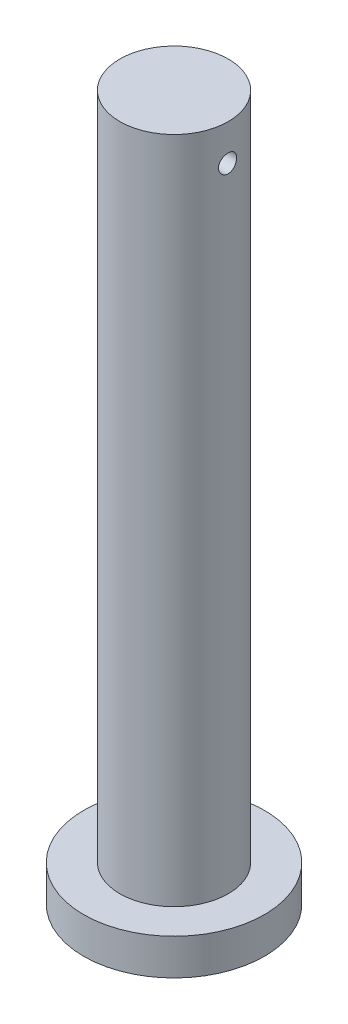
ISO-10303-21;
HEADER;
FILE_DESCRIPTION(('STEP AP214'),'2;1');
FILE_NAME('part.step','',(''),(''),'','','');
FILE_SCHEMA(('AUTOMOTIVE_DESIGN { 1 0 10303 214 1 1 1 1 }'));
ENDSEC;
DATA;
#1=APPLICATION_CONTEXT('core data for automotive mechanical design processes');
#2=APPLICATION_PROTOCOL_DEFINITION('international standard','automotive_design',2000,#1);
#3=PRODUCT_CONTEXT('',#1,'mechanical');
#4=PRODUCT('Part','Part','',(#3));
#5=PRODUCT_RELATED_PRODUCT_CATEGORY('part','',(#4));
#6=PRODUCT_DEFINITION_FORMATION('','',#4);
#7=PRODUCT_DEFINITION_CONTEXT('part definition',#1,'design');
#8=PRODUCT_DEFINITION('design','',#6,#7);
#9=PRODUCT_DEFINITION_SHAPE('','',#8);
#10=(LENGTH_UNIT() NAMED_UNIT(*) SI_UNIT(.MILLI.,.METRE.));
#11=(NAMED_UNIT(*) PLANE_ANGLE_UNIT() SI_UNIT($,.RADIAN.));
#12=(NAMED_UNIT(*) SI_UNIT($,.STERADIAN.) SOLID_ANGLE_UNIT());
#13=UNCERTAINTY_MEASURE_WITH_UNIT(LENGTH_MEASURE(1.E-05),#10,'distance_accuracy_value','');
#14=(GEOMETRIC_REPRESENTATION_CONTEXT(3) GLOBAL_UNCERTAINTY_ASSIGNED_CONTEXT((#13)) GLOBAL_UNIT_ASSIGNED_CONTEXT((#10,
#11,#12)) REPRESENTATION_CONTEXT('',''));
#15=CARTESIAN_POINT('',(0.,0.,0.));
#16=DIRECTION('',(0.,0.,1.));
#17=DIRECTION('',(1.,0.,0.));
#18=AXIS2_PLACEMENT_3D('',#15,#16,#17);
#19=CARTESIAN_POINT('',(0.,10.,0.));
#20=DIRECTION('',(0.,-1.,0.));
#21=DIRECTION('',(0.,0.,-1.));
#22=AXIS2_PLACEMENT_3D('',#19,#20,#21);
#23=CYLINDRICAL_SURFACE('',#22,25.);
#24=CARTESIAN_POINT('',(0.,10.,0.));
#25=DIRECTION('',(0.,1.,0.));
#26=DIRECTION('',(0.,0.,1.));
#27=AXIS2_PLACEMENT_3D('',#24,#25,#26);
#28=CIRCLE('',#27,25.);
#29=CARTESIAN_POINT('',(0.,10.,25.));
#30=VERTEX_POINT('',#29);
#31=EDGE_CURVE('E49',#30,#30,#28,.T.);
#32=ORIENTED_EDGE('',*,*,#31,.F.);
#33=EDGE_LOOP('',(#32));
#34=FACE_BOUND('',#33,.T.);
#35=CARTESIAN_POINT('',(0.,0.,0.));
#36=DIRECTION('',(0.,1.,0.));
#37=DIRECTION('',(0.,0.,1.));
#38=AXIS2_PLACEMENT_3D('',#35,#36,#37);
#39=CIRCLE('',#38,25.);
#40=CARTESIAN_POINT('',(0.,0.,25.));
#41=VERTEX_POINT('',#40);
#42=EDGE_CURVE('E54',#41,#41,#39,.T.);
#43=ORIENTED_EDGE('',*,*,#42,.T.);
#44=EDGE_LOOP('',(#43));
#45=FACE_BOUND('',#44,.T.);
#46=ADVANCED_FACE('F37',(#34,#45),#23,.T.);
#47=CARTESIAN_POINT('',(0.,10.,0.));
#48=DIRECTION('',(0.,1.,0.));
#49=DIRECTION('',(0.,0.,1.));
#50=AXIS2_PLACEMENT_3D('',#47,#48,#49);
#51=PLANE('',#50);
#52=CARTESIAN_POINT('',(0.,10.,0.));
#53=DIRECTION('',(0.,1.,0.));
#54=DIRECTION('',(0.,0.,1.));
#55=AXIS2_PLACEMENT_3D('',#52,#53,#54);
#56=CIRCLE('',#55,15.);
#57=CARTESIAN_POINT('',(0.,10.,15.));
#58=VERTEX_POINT('',#57);
#59=EDGE_CURVE('E10',#58,#58,#56,.T.);
#60=ORIENTED_EDGE('',*,*,#59,.F.);
#61=EDGE_LOOP('',(#60));
#62=FACE_BOUND('',#61,.T.);
#63=ORIENTED_EDGE('',*,*,#31,.T.);
#64=EDGE_LOOP('',(#63));
#65=FACE_BOUND('',#64,.T.);
#66=ADVANCED_FACE('F85',(#62,#65),#51,.T.);
#67=CARTESIAN_POINT('',(0.,0.,0.));
#68=DIRECTION('',(0.,1.,0.));
#69=DIRECTION('',(0.,0.,1.));
#70=AXIS2_PLACEMENT_3D('',#67,#68,#69);
#71=PLANE('',#70);
#72=ORIENTED_EDGE('',*,*,#42,.F.);
#73=EDGE_LOOP('',(#72));
#74=FACE_BOUND('',#73,.T.);
#75=ADVANCED_FACE('F81',(#74),#71,.F.);
#76=CARTESIAN_POINT('',(0.,195.,0.));
#77=DIRECTION('',(0.,-1.,0.));
#78=DIRECTION('',(0.,0.,-1.));
#79=AXIS2_PLACEMENT_3D('',#76,#77,#78);
#80=CYLINDRICAL_SURFACE('',#79,15.);
#81=CARTESIAN_POINT('',(-14.790199457749,185.,-2.5));
#82=CARTESIAN_POINT('',(-14.790201973666,185.139375748162,-2.49999439841983));
#83=CARTESIAN_POINT('',(-14.7921909238523,185.278827606071,-2.48830516902828));
#84=CARTESIAN_POINT('',(-14.7999245720004,185.553818543263,-2.44187742806638));
#85=CARTESIAN_POINT('',(-14.8056727334637,185.689353893758,-2.40711766030861));
#86=CARTESIAN_POINT('',(-14.8202560936731,185.952492283342,-2.3156295436705));
#87=CARTESIAN_POINT('',(-14.8290887118401,186.080101848662,-2.25891955493198));
#88=CARTESIAN_POINT('',(-14.8488427210228,186.323980954718,-2.12518649688946));
#89=CARTESIAN_POINT('',(-14.8597638769423,186.440251769577,-2.04816571350132));
#90=CARTESIAN_POINT('',(-14.8825847115588,186.659312849745,-1.87518752696653));
#91=CARTESIAN_POINT('',(-14.8944921732795,186.761975131386,-1.77906904893232));
#92=CARTESIAN_POINT('',(-14.9178748066858,186.949793306862,-1.57097200469526));
#93=CARTESIAN_POINT('',(-14.9293499527173,187.034948163115,-1.45899249914996));
#94=CARTESIAN_POINT('',(-14.9506573698271,187.185814567219,-1.22152286994836));
#95=CARTESIAN_POINT('',(-14.9604794243234,187.251407007732,-1.09595608145672));
#96=CARTESIAN_POINT('',(-14.9772873695709,187.360521070531,-0.83539562172388));
#97=CARTESIAN_POINT('',(-14.9842734447266,187.404044127885,-0.700402564078197));
#98=CARTESIAN_POINT('',(-14.994567347244,187.467392534984,-0.426143726344252));
#99=CARTESIAN_POINT('',(-14.9979085311091,187.487432916005,-0.286928886679282));
#100=CARTESIAN_POINT('',(-15.0006507934278,187.503915754153,-0.00707528552580894));
#101=CARTESIAN_POINT('',(-15.0000521396931,187.500359815247,0.133563378528888));
#102=CARTESIAN_POINT('',(-14.9950085843139,187.469918648472,0.410802185078867));
#103=CARTESIAN_POINT('',(-14.990601836924,187.443264836591,0.547428530700132));
#104=CARTESIAN_POINT('',(-14.9784797877164,187.367748925753,0.814241979611784));
#105=CARTESIAN_POINT('',(-14.9707643851321,187.318886150411,0.9444288866515));
#106=CARTESIAN_POINT('',(-14.9528269851196,187.200109359685,1.19535614778264));
#107=CARTESIAN_POINT('',(-14.9425936732688,187.130099987918,1.31605052301904));
#108=CARTESIAN_POINT('',(-14.920757380715,186.971087177365,1.54406552984663));
#109=CARTESIAN_POINT('',(-14.9091542891913,186.882082201289,1.65138507791587));
#110=CARTESIAN_POINT('',(-14.885702682326,186.686321193381,1.85097127344666));
#111=CARTESIAN_POINT('',(-14.8738528973104,186.579362905099,1.94303950225321));
#112=CARTESIAN_POINT('',(-14.8513795978481,186.351412909784,2.10795458844807));
#113=CARTESIAN_POINT('',(-14.8407560947132,186.230421073317,2.18080126853242));
#114=CARTESIAN_POINT('',(-14.8219375456182,185.977608358123,2.30524443448828));
#115=CARTESIAN_POINT('',(-14.813745233026,185.845775501908,2.35681702727924));
#116=CARTESIAN_POINT('',(-14.8007618868988,185.575150927692,2.43702987081561));
#117=CARTESIAN_POINT('',(-14.7959705538832,185.436359823568,2.46567214076795));
#118=CARTESIAN_POINT('',(-14.7903895942212,185.157533843838,2.49893188487927));
#119=CARTESIAN_POINT('',(-14.7895528575867,185.017533620298,2.50383220791244));
#120=CARTESIAN_POINT('',(-14.7918503478236,184.738713328309,2.49022270268246));
#121=CARTESIAN_POINT('',(-14.7949844213185,184.599893214486,2.47171377862467));
#122=CARTESIAN_POINT('',(-14.8048268745502,184.328272240809,2.4120523349281));
#123=CARTESIAN_POINT('',(-14.8115125191835,184.195438860122,2.37104379064639));
#124=CARTESIAN_POINT('',(-14.827685730055,183.938529833721,2.26769819019229));
#125=CARTESIAN_POINT('',(-14.8371734639058,183.814454712449,2.20535985810096));
#126=CARTESIAN_POINT('',(-14.8579912839739,183.577325405594,2.06045667322925));
#127=CARTESIAN_POINT('',(-14.8693375560035,183.464383427244,1.97771056415938));
#128=CARTESIAN_POINT('',(-14.8925466667987,183.253886467305,1.79458946570799));
#129=CARTESIAN_POINT('',(-14.9044095418533,183.15633256889,1.69421323638406));
#130=CARTESIAN_POINT('',(-14.9274642211826,182.978348107271,1.47742807032882));
#131=CARTESIAN_POINT('',(-14.9386477634467,182.898106173715,1.3608632533862));
#132=CARTESIAN_POINT('',(-14.9589511243294,182.758344672995,1.11574344794933));
#133=CARTESIAN_POINT('',(-14.9680710096998,182.698824435526,0.987188847470637));
#134=CARTESIAN_POINT('',(-14.9831835816958,182.602489416045,0.72229905150134));
#135=CARTESIAN_POINT('',(-14.9891898456762,182.565575924265,0.586000562602619));
#136=CARTESIAN_POINT('',(-14.9974558316928,182.515184401036,0.309030734874214));
#137=CARTESIAN_POINT('',(-14.9997158620019,182.501704441268,0.168359756821622));
#138=CARTESIAN_POINT('',(-15.0002303788781,182.498618117688,-0.111541275773678));
#139=CARTESIAN_POINT('',(-14.9985330202419,182.508724746059,-0.250768160602667));
#140=CARTESIAN_POINT('',(-14.9914217838733,182.551903922269,-0.525511974314706));
#141=CARTESIAN_POINT('',(-14.9860079269518,182.58497634151,-0.661028923967477));
#142=CARTESIAN_POINT('',(-14.972069888274,182.673038165544,-0.92439644591853));
#143=CARTESIAN_POINT('',(-14.9635491704088,182.72800316821,-1.05225537215381));
#144=CARTESIAN_POINT('',(-14.9443275687803,182.858257936231,-1.29698045298215));
#145=CARTESIAN_POINT('',(-14.9336265816741,182.933548665062,-1.41384608611821));
#146=CARTESIAN_POINT('',(-14.9110762961641,183.10333509246,-1.63471294552639));
#147=CARTESIAN_POINT('',(-14.8992152454112,183.198040954751,-1.73855143060275));
#148=CARTESIAN_POINT('',(-14.8757630331437,183.403528307904,-1.92896387595091));
#149=CARTESIAN_POINT('',(-14.8641719354951,183.514313558913,-2.01553378671189));
#150=CARTESIAN_POINT('',(-14.8424834353391,183.74974532249,-2.16951427091085));
#151=CARTESIAN_POINT('',(-14.8323971784578,183.874484339765,-2.23678498905769));
#152=CARTESIAN_POINT('',(-14.8149921009131,184.133609235838,-2.34931453640427));
#153=CARTESIAN_POINT('',(-14.8076705172488,184.267985322677,-2.39459535522307));
#154=CARTESIAN_POINT('',(-14.7982474485649,184.502403769487,-2.45202605312742));
#155=CARTESIAN_POINT('',(-14.7952462341947,184.601026807963,-2.46998741767139));
#156=CARTESIAN_POINT('',(-14.7912213528807,184.799753484837,-2.49397629518131));
#157=CARTESIAN_POINT('',(-14.7901976500369,184.899857096324,-2.50000402479277));
#158=CARTESIAN_POINT('',(-14.790199457749,185.,-2.5));
#159=B_SPLINE_CURVE_WITH_KNOTS('',3,(#81,#82,#83,#84,#85,#86,#87,#88,#89,#90,#91,#92,#93,#94,
#95,#96,#97,#98,#99,#100,#101,#102,#103,#104,#105,#106,#107,#108,#109,#110,#111,#112,#113,#114,
#115,#116,#117,#118,#119,#120,#121,#122,#123,#124,#125,#126,#127,#128,#129,#130,#131,#132,#133,
#134,#135,#136,#137,#138,#139,#140,#141,#142,#143,#144,#145,#146,#147,#148,#149,#150,#151,#152,
#153,#154,#155,#156,#157,#158),.UNSPECIFIED.,.T.,.F.,(4,2,2,2,2,2,2,2,2,2,2,2,2,2,2,2,2,2,2,2,2,
2,2,2,2,2,2,2,2,2,2,2,2,2,2,2,2,2,4),(0.,0.417761038927736,0.835907519962962,1.25370499787522,
1.67145547405275,2.09289159155718,2.51435267834448,2.93832980111434,3.36227935111112,
3.78231567472564,4.20232344652691,4.61817121164668,5.03403164249533,5.45179604139425,
5.86959426226764,6.29246123462125,6.71533210746018,7.13867662498602,7.56198385938074,
7.98023542420408,8.39847083413977,8.81406064635489,9.22967532293572,9.64912342762701,
10.0686010443069,10.4924411303538,10.916267504767,11.3382298441765,11.7601574591235,
12.1769777626592,12.5937957321882,13.0101503983246,13.4265248039234,13.8476699746325,
14.2689137888181,14.6931372761832,15.1169356674445,15.4171067054376,15.7172722940182),.UNSPECIFIED.);
#160=CARTESIAN_POINT('',(-14.790199457749,185.,-2.5));
#161=VERTEX_POINT('',#160);
#162=EDGE_CURVE('E40',#161,#161,#159,.T.);
#163=ORIENTED_EDGE('',*,*,#162,.T.);
#164=EDGE_LOOP('',(#163));
#165=FACE_BOUND('',#164,.T.);
#166=CARTESIAN_POINT('',(14.790199457749,185.,-2.5));
#167=CARTESIAN_POINT('',(14.790201973666,184.860624251838,-2.49999439841983));
#168=CARTESIAN_POINT('',(14.7921909238523,184.721172393929,-2.48830516902829));
#169=CARTESIAN_POINT('',(14.7999245720004,184.446181456737,-2.44187742806638));
#170=CARTESIAN_POINT('',(14.8056727334637,184.310646106242,-2.40711766030861));
#171=CARTESIAN_POINT('',(14.8202560936731,184.047507716658,-2.3156295436705));
#172=CARTESIAN_POINT('',(14.8290887118401,183.919898151338,-2.25891955493198));
#173=CARTESIAN_POINT('',(14.8488427210228,183.676019045282,-2.12518649688946));
#174=CARTESIAN_POINT('',(14.8597638769423,183.559748230423,-2.04816571350132));
#175=CARTESIAN_POINT('',(14.8825847115588,183.340687150255,-1.87518752696653));
#176=CARTESIAN_POINT('',(14.8944921732795,183.238024868614,-1.77906904893232));
#177=CARTESIAN_POINT('',(14.9178748066858,183.050206693138,-1.57097200469526));
#178=CARTESIAN_POINT('',(14.9293499527173,182.965051836885,-1.45899249914996));
#179=CARTESIAN_POINT('',(14.9506573698271,182.814185432781,-1.22152286994836));
#180=CARTESIAN_POINT('',(14.9604794243234,182.748592992268,-1.09595608145672));
#181=CARTESIAN_POINT('',(14.9772873695709,182.639478929469,-0.83539562172388));
#182=CARTESIAN_POINT('',(14.9842734447266,182.595955872115,-0.700402564078197));
#183=CARTESIAN_POINT('',(14.994567347244,182.532607465016,-0.426143726344252));
#184=CARTESIAN_POINT('',(14.9979085311091,182.512567083995,-0.286928886679282));
#185=CARTESIAN_POINT('',(15.0006507934278,182.496084245847,-0.00707528552580888));
#186=CARTESIAN_POINT('',(15.0000521396931,182.499640184753,0.133563378528888));
#187=CARTESIAN_POINT('',(14.9950085843139,182.530081351528,0.410802185078864));
#188=CARTESIAN_POINT('',(14.990601836924,182.556735163409,0.547428530700126));
#189=CARTESIAN_POINT('',(14.9784797877164,182.632251074246,0.81424197961178));
#190=CARTESIAN_POINT('',(14.9707643851321,182.681113849589,0.944428886651498));
#191=CARTESIAN_POINT('',(14.9528269851196,182.799890640315,1.19535614778264));
#192=CARTESIAN_POINT('',(14.9425936732688,182.869900012082,1.31605052301904));
#193=CARTESIAN_POINT('',(14.920757380715,183.028912822635,1.54406552984663));
#194=CARTESIAN_POINT('',(14.9091542891913,183.117917798711,1.65138507791587));
#195=CARTESIAN_POINT('',(14.885702682326,183.313678806619,1.85097127344666));
#196=CARTESIAN_POINT('',(14.8738528973104,183.420637094901,1.94303950225321));
#197=CARTESIAN_POINT('',(14.8513795978481,183.648587090216,2.10795458844807));
#198=CARTESIAN_POINT('',(14.8407560947132,183.769578926683,2.18080126853242));
#199=CARTESIAN_POINT('',(14.8219375456182,184.022391641877,2.30524443448828));
#200=CARTESIAN_POINT('',(14.813745233026,184.154224498092,2.35681702727924));
#201=CARTESIAN_POINT('',(14.8007618868988,184.424849072308,2.43702987081561));
#202=CARTESIAN_POINT('',(14.7959705538832,184.563640176432,2.46567214076795));
#203=CARTESIAN_POINT('',(14.7903895942212,184.842466156162,2.49893188487927));
#204=CARTESIAN_POINT('',(14.7895528575867,184.982466379702,2.50383220791244));
#205=CARTESIAN_POINT('',(14.7918503478236,185.261286671691,2.49022270268246));
#206=CARTESIAN_POINT('',(14.7949844213185,185.400106785514,2.47171377862467));
#207=CARTESIAN_POINT('',(14.8048268745502,185.671727759191,2.4120523349281));
#208=CARTESIAN_POINT('',(14.8115125191835,185.804561139878,2.37104379064639));
#209=CARTESIAN_POINT('',(14.827685730055,186.061470166279,2.26769819019229));
#210=CARTESIAN_POINT('',(14.8371734639058,186.185545287551,2.20535985810096));
#211=CARTESIAN_POINT('',(14.8579912839739,186.422674594406,2.06045667322925));
#212=CARTESIAN_POINT('',(14.8693375560035,186.535616572756,1.97771056415938));
#213=CARTESIAN_POINT('',(14.8925466667987,186.746113532695,1.79458946570799));
#214=CARTESIAN_POINT('',(14.9044095418533,186.84366743111,1.69421323638406));
#215=CARTESIAN_POINT('',(14.9274642211826,187.021651892729,1.47742807032882));
#216=CARTESIAN_POINT('',(14.9386477634467,187.101893826285,1.3608632533862));
#217=CARTESIAN_POINT('',(14.9589511243294,187.241655327005,1.11574344794933));
#218=CARTESIAN_POINT('',(14.9680710096998,187.301175564474,0.987188847470637));
#219=CARTESIAN_POINT('',(14.9831835816958,187.397510583955,0.72229905150134));
#220=CARTESIAN_POINT('',(14.9891898456762,187.434424075735,0.586000562602619));
#221=CARTESIAN_POINT('',(14.9974558316928,187.484815598964,0.309030734874214));
#222=CARTESIAN_POINT('',(14.9997158620019,187.498295558732,0.168359756821622));
#223=CARTESIAN_POINT('',(15.0002303788781,187.501381882312,-0.111541275773672));
#224=CARTESIAN_POINT('',(14.9985330202419,187.491275253941,-0.250768160602656));
#225=CARTESIAN_POINT('',(14.9914217838733,187.448096077731,-0.525511974314695));
#226=CARTESIAN_POINT('',(14.9860079269518,187.41502365849,-0.661028923967472));
#227=CARTESIAN_POINT('',(14.972069888274,187.326961834456,-0.92439644591853));
#228=CARTESIAN_POINT('',(14.9635491704088,187.27199683179,-1.05225537215381));
#229=CARTESIAN_POINT('',(14.9443275687803,187.141742063769,-1.29698045298215));
#230=CARTESIAN_POINT('',(14.9336265816741,187.066451334938,-1.41384608611821));
#231=CARTESIAN_POINT('',(14.9110762961641,186.89666490754,-1.63471294552639));
#232=CARTESIAN_POINT('',(14.8992152454112,186.801959045249,-1.73855143060275));
#233=CARTESIAN_POINT('',(14.8757630331437,186.596471692096,-1.92896387595091));
#234=CARTESIAN_POINT('',(14.8641719354951,186.485686441087,-2.01553378671189));
#235=CARTESIAN_POINT('',(14.8424834353391,186.25025467751,-2.16951427091085));
#236=CARTESIAN_POINT('',(14.8323971784578,186.125515660235,-2.23678498905769));
#237=CARTESIAN_POINT('',(14.8149921009131,185.866390764162,-2.34931453640427));
#238=CARTESIAN_POINT('',(14.8076705172488,185.732014677323,-2.39459535522307));
#239=CARTESIAN_POINT('',(14.7982474485649,185.497596230513,-2.45202605312742));
#240=CARTESIAN_POINT('',(14.7952462341947,185.398973192037,-2.46998741767139));
#241=CARTESIAN_POINT('',(14.7912213528807,185.200246515163,-2.49397629518131));
#242=CARTESIAN_POINT('',(14.7901976500369,185.100142903676,-2.50000402479277));
#243=CARTESIAN_POINT('',(14.790199457749,185.,-2.5));
#244=B_SPLINE_CURVE_WITH_KNOTS('',3,(#166,#167,#168,#169,#170,#171,#172,#173,#174,#175,#176,
#177,#178,#179,#180,#181,#182,#183,#184,#185,#186,#187,#188,#189,#190,#191,#192,#193,#194,#195,
#196,#197,#198,#199,#200,#201,#202,#203,#204,#205,#206,#207,#208,#209,#210,#211,#212,#213,#214,
#215,#216,#217,#218,#219,#220,#221,#222,#223,#224,#225,#226,#227,#228,#229,#230,#231,#232,#233,
#234,#235,#236,#237,#238,#239,#240,#241,#242,#243),.UNSPECIFIED.,.T.,.F.,(4,2,2,2,2,2,2,2,2,2,2,
2,2,2,2,2,2,2,2,2,2,2,2,2,2,2,2,2,2,2,2,2,2,2,2,2,2,2,4),(0.,0.417761038927708,
0.835907519962962,1.25370499787522,1.67145547405275,2.09289159155718,2.51435267834448,
2.93832980111435,3.36227935111112,3.78231567472565,4.20232344652691,4.61817121164667,
5.03403164249533,5.45179604139425,5.86959426226765,6.29246123462125,6.71533210746019,
7.13867662498602,7.56198385938074,7.98023542420408,8.39847083413977,8.81406064635489,
9.22967532293572,9.64912342762702,10.0686010443069,10.4924411303538,10.916267504767,
11.3382298441765,11.7601574591235,12.1769777626592,12.5937957321882,13.0101503983246,
13.4265248039234,13.8476699746325,14.2689137888181,14.6931372761832,15.1169356674446,
15.4171067054377,15.7172722940182),.UNSPECIFIED.);
#245=CARTESIAN_POINT('',(14.790199457749,185.,-2.5));
#246=VERTEX_POINT('',#245);
#247=EDGE_CURVE('E60',#246,#246,#244,.T.);
#248=ORIENTED_EDGE('',*,*,#247,.T.);
#249=EDGE_LOOP('',(#248));
#250=FACE_BOUND('',#249,.T.);
#251=CARTESIAN_POINT('',(0.,195.,0.));
#252=DIRECTION('',(0.,1.,0.));
#253=DIRECTION('',(0.,0.,1.));
#254=AXIS2_PLACEMENT_3D('',#251,#252,#253);
#255=CIRCLE('',#254,15.);
#256=CARTESIAN_POINT('',(0.,195.,15.));
#257=VERTEX_POINT('',#256);
#258=EDGE_CURVE('E57',#257,#257,#255,.T.);
#259=ORIENTED_EDGE('',*,*,#258,.F.);
#260=EDGE_LOOP('',(#259));
#261=FACE_BOUND('',#260,.T.);
#262=ORIENTED_EDGE('',*,*,#59,.T.);
#263=EDGE_LOOP('',(#262));
#264=FACE_BOUND('',#263,.T.);
#265=ADVANCED_FACE('F65',(#165,#250,#261,#264),#80,.T.);
#266=CARTESIAN_POINT('',(0.,195.,0.));
#267=DIRECTION('',(0.,1.,0.));
#268=DIRECTION('',(0.,0.,1.));
#269=AXIS2_PLACEMENT_3D('',#266,#267,#268);
#270=PLANE('',#269);
#271=ORIENTED_EDGE('',*,*,#258,.T.);
#272=EDGE_LOOP('',(#271));
#273=FACE_BOUND('',#272,.T.);
#274=ADVANCED_FACE('F72',(#273),#270,.T.);
#275=CARTESIAN_POINT('',(-92.5,185.,0.));
#276=DIRECTION('',(1.,0.,0.));
#277=DIRECTION('',(0.,0.,-1.));
#278=AXIS2_PLACEMENT_3D('',#275,#276,#277);
#279=CYLINDRICAL_SURFACE('',#278,2.5);
#280=ORIENTED_EDGE('',*,*,#247,.F.);
#281=EDGE_LOOP('',(#280));
#282=FACE_BOUND('',#281,.T.);
#283=ORIENTED_EDGE('',*,*,#162,.F.);
#284=EDGE_LOOP('',(#283));
#285=FACE_BOUND('',#284,.T.);
#286=ADVANCED_FACE('F69',(#282,#285),#279,.F.);
#287=CLOSED_SHELL('',(#46,#66,#75,#265,#274,#286));
#288=MANIFOLD_SOLID_BREP('B2',#287);
#289=ADVANCED_BREP_SHAPE_REPRESENTATION('',(#18,#288),#14);
#290=SHAPE_DEFINITION_REPRESENTATION(#9,#289);
ENDSEC;
END-ISO-10303-21;
